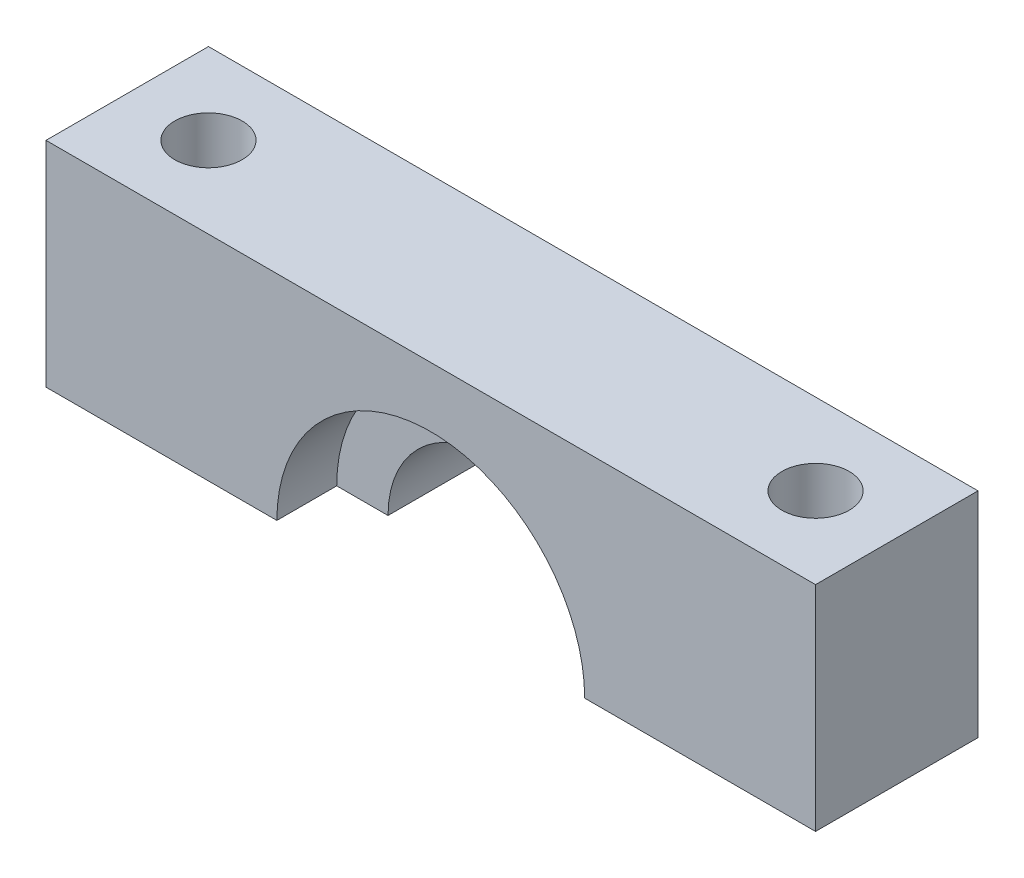
ISO-10303-21;
HEADER;
FILE_DESCRIPTION(('STEP AP214'),'2;1');
FILE_NAME('part.step','',(''),(''),'','','');
FILE_SCHEMA(('AUTOMOTIVE_DESIGN { 1 0 10303 214 1 1 1 1 }'));
ENDSEC;
DATA;
#1=APPLICATION_CONTEXT('core data for automotive mechanical design processes');
#2=APPLICATION_PROTOCOL_DEFINITION('international standard','automotive_design',2000,#1);
#3=PRODUCT_CONTEXT('',#1,'mechanical');
#4=PRODUCT('Part','Part','',(#3));
#5=PRODUCT_RELATED_PRODUCT_CATEGORY('part','',(#4));
#6=PRODUCT_DEFINITION_FORMATION('','',#4);
#7=PRODUCT_DEFINITION_CONTEXT('part definition',#1,'design');
#8=PRODUCT_DEFINITION('design','',#6,#7);
#9=PRODUCT_DEFINITION_SHAPE('','',#8);
#10=(LENGTH_UNIT() NAMED_UNIT(*) SI_UNIT(.MILLI.,.METRE.));
#11=(NAMED_UNIT(*) PLANE_ANGLE_UNIT() SI_UNIT($,.RADIAN.));
#12=(NAMED_UNIT(*) SI_UNIT($,.STERADIAN.) SOLID_ANGLE_UNIT());
#13=UNCERTAINTY_MEASURE_WITH_UNIT(LENGTH_MEASURE(1.E-05),#10,'distance_accuracy_value','');
#14=(GEOMETRIC_REPRESENTATION_CONTEXT(3) GLOBAL_UNCERTAINTY_ASSIGNED_CONTEXT((#13)) GLOBAL_UNIT_ASSIGNED_CONTEXT((#10,
#11,#12)) REPRESENTATION_CONTEXT('',''));
#15=CARTESIAN_POINT('',(0.,0.,0.));
#16=DIRECTION('',(0.,0.,1.));
#17=DIRECTION('',(1.,0.,0.));
#18=AXIS2_PLACEMENT_3D('',#15,#16,#17);
#19=CARTESIAN_POINT('',(-22.86,-6.35,9.652));
#20=DIRECTION('',(0.,1.,0.));
#21=DIRECTION('',(0.,0.,1.));
#22=AXIS2_PLACEMENT_3D('',#19,#20,#21);
#23=PLANE('',#22);
#24=CARTESIAN_POINT('',(-18.034,-6.35,4.82600000000002));
#25=DIRECTION('',(0.,1.,0.));
#26=DIRECTION('',(0.,0.,1.));
#27=AXIS2_PLACEMENT_3D('',#24,#25,#26);
#28=CIRCLE('',#27,2.);
#29=CARTESIAN_POINT('',(-18.034,-6.35,6.82600000000002));
#30=VERTEX_POINT('',#29);
#31=EDGE_CURVE('E197',#30,#30,#28,.T.);
#32=ORIENTED_EDGE('',*,*,#31,.T.);
#33=EDGE_LOOP('',(#32));
#34=FACE_BOUND('',#33,.T.);
#35=DIRECTION('',(1.,0.,0.));
#36=VECTOR('',#35,1.);
#37=CARTESIAN_POINT('',(-22.86,-6.35,0.));
#38=LINE('',#37,#36);
#39=CARTESIAN_POINT('',(-22.86,-6.35,0.));
#40=VERTEX_POINT('',#39);
#41=CARTESIAN_POINT('',(-6.096,-6.35,0.));
#42=VERTEX_POINT('',#41);
#43=EDGE_CURVE('E126',#40,#42,#38,.T.);
#44=ORIENTED_EDGE('',*,*,#43,.T.);
#45=DIRECTION('',(0.,0.,1.));
#46=VECTOR('',#45,1.);
#47=CARTESIAN_POINT('',(-6.096,-6.35,0.));
#48=LINE('',#47,#46);
#49=CARTESIAN_POINT('',(-6.096,-6.35,6.09600000000002));
#50=VERTEX_POINT('',#49);
#51=EDGE_CURVE('E110',#42,#50,#48,.T.);
#52=ORIENTED_EDGE('',*,*,#51,.T.);
#53=DIRECTION('',(1.,0.,0.));
#54=VECTOR('',#53,1.);
#55=CARTESIAN_POINT('',(-9.144,-6.35,6.09600000000002));
#56=LINE('',#55,#54);
#57=CARTESIAN_POINT('',(-9.144,-6.35,6.09600000000002));
#58=VERTEX_POINT('',#57);
#59=EDGE_CURVE('E181',#58,#50,#56,.T.);
#60=ORIENTED_EDGE('',*,*,#59,.F.);
#61=DIRECTION('',(0.,0.,1.));
#62=VECTOR('',#61,1.);
#63=CARTESIAN_POINT('',(-9.144,-6.35,6.09600000000002));
#64=LINE('',#63,#62);
#65=CARTESIAN_POINT('',(-9.144,-6.35,9.65200000000002));
#66=VERTEX_POINT('',#65);
#67=EDGE_CURVE('E177',#58,#66,#64,.T.);
#68=ORIENTED_EDGE('',*,*,#67,.T.);
#69=DIRECTION('',(1.,0.,0.));
#70=VECTOR('',#69,1.);
#71=CARTESIAN_POINT('',(-22.86,-6.35,9.652));
#72=LINE('',#71,#70);
#73=CARTESIAN_POINT('',(-22.86,-6.35,9.652));
#74=VERTEX_POINT('',#73);
#75=EDGE_CURVE('E151',#74,#66,#72,.T.);
#76=ORIENTED_EDGE('',*,*,#75,.F.);
#77=DIRECTION('',(0.,0.,-1.));
#78=VECTOR('',#77,1.);
#79=CARTESIAN_POINT('',(-22.86,-6.35,9.652));
#80=LINE('',#79,#78);
#81=EDGE_CURVE('E134',#74,#40,#80,.T.);
#82=ORIENTED_EDGE('',*,*,#81,.T.);
#83=EDGE_LOOP('',(#44,#52,#60,#68,#76,#82));
#84=FACE_BOUND('',#83,.T.);
#85=ADVANCED_FACE('F45',(#34,#84),#23,.F.);
#86=CARTESIAN_POINT('',(22.86,-6.35,9.652));
#87=DIRECTION('',(-1.,0.,0.));
#88=DIRECTION('',(0.,0.,1.));
#89=AXIS2_PLACEMENT_3D('',#86,#87,#88);
#90=PLANE('',#89);
#91=DIRECTION('',(0.,1.,0.));
#92=VECTOR('',#91,1.);
#93=CARTESIAN_POINT('',(22.86,-6.35,0.));
#94=LINE('',#93,#92);
#95=CARTESIAN_POINT('',(22.86,-6.35,0.));
#96=VERTEX_POINT('',#95);
#97=CARTESIAN_POINT('',(22.86,6.35,0.));
#98=VERTEX_POINT('',#97);
#99=EDGE_CURVE('E164',#96,#98,#94,.T.);
#100=ORIENTED_EDGE('',*,*,#99,.T.);
#101=DIRECTION('',(0.,0.,-1.));
#102=VECTOR('',#101,1.);
#103=CARTESIAN_POINT('',(22.86,6.35,9.652));
#104=LINE('',#103,#102);
#105=CARTESIAN_POINT('',(22.86,6.35,9.652));
#106=VERTEX_POINT('',#105);
#107=EDGE_CURVE('E11',#106,#98,#104,.T.);
#108=ORIENTED_EDGE('',*,*,#107,.F.);
#109=DIRECTION('',(0.,1.,0.));
#110=VECTOR('',#109,1.);
#111=CARTESIAN_POINT('',(22.86,-6.35,9.652));
#112=LINE('',#111,#110);
#113=CARTESIAN_POINT('',(22.86,-6.35,9.652));
#114=VERTEX_POINT('',#113);
#115=EDGE_CURVE('E136',#114,#106,#112,.T.);
#116=ORIENTED_EDGE('',*,*,#115,.F.);
#117=DIRECTION('',(0.,0.,-1.));
#118=VECTOR('',#117,1.);
#119=CARTESIAN_POINT('',(22.86,-6.35,9.652));
#120=LINE('',#119,#118);
#121=EDGE_CURVE('E147',#114,#96,#120,.T.);
#122=ORIENTED_EDGE('',*,*,#121,.T.);
#123=EDGE_LOOP('',(#100,#108,#116,#122));
#124=FACE_BOUND('',#123,.T.);
#125=ADVANCED_FACE('F47',(#124),#90,.F.);
#126=CARTESIAN_POINT('',(-22.86,6.35,9.652));
#127=DIRECTION('',(0.,-1.,0.));
#128=DIRECTION('',(0.,0.,-1.));
#129=AXIS2_PLACEMENT_3D('',#126,#127,#128);
#130=PLANE('',#129);
#131=CARTESIAN_POINT('',(-18.034,6.35,4.826));
#132=DIRECTION('',(0.,1.,0.));
#133=DIRECTION('',(0.,0.,1.));
#134=AXIS2_PLACEMENT_3D('',#131,#132,#133);
#135=CIRCLE('',#134,2.);
#136=CARTESIAN_POINT('',(-18.034,6.35,6.82600000000001));
#137=VERTEX_POINT('',#136);
#138=EDGE_CURVE('E207',#137,#137,#135,.T.);
#139=ORIENTED_EDGE('',*,*,#138,.F.);
#140=EDGE_LOOP('',(#139));
#141=FACE_BOUND('',#140,.T.);
#142=CARTESIAN_POINT('',(18.034,6.35,4.826));
#143=DIRECTION('',(0.,1.,0.));
#144=DIRECTION('',(0.,0.,-1.));
#145=AXIS2_PLACEMENT_3D('',#142,#143,#144);
#146=CIRCLE('',#145,2.);
#147=CARTESIAN_POINT('',(18.034,6.35,2.82599999999999));
#148=VERTEX_POINT('',#147);
#149=EDGE_CURVE('E203',#148,#148,#146,.T.);
#150=ORIENTED_EDGE('',*,*,#149,.F.);
#151=EDGE_LOOP('',(#150));
#152=FACE_BOUND('',#151,.T.);
#153=DIRECTION('',(-1.,0.,0.));
#154=VECTOR('',#153,1.);
#155=CARTESIAN_POINT('',(-22.86,6.35,0.));
#156=LINE('',#155,#154);
#157=CARTESIAN_POINT('',(-22.86,6.35,0.));
#158=VERTEX_POINT('',#157);
#159=EDGE_CURVE('E161',#98,#158,#156,.T.);
#160=ORIENTED_EDGE('',*,*,#159,.T.);
#161=DIRECTION('',(0.,0.,-1.));
#162=VECTOR('',#161,1.);
#163=CARTESIAN_POINT('',(-22.86,6.35,9.652));
#164=LINE('',#163,#162);
#165=CARTESIAN_POINT('',(-22.86,6.35,9.652));
#166=VERTEX_POINT('',#165);
#167=EDGE_CURVE('E54',#166,#158,#164,.T.);
#168=ORIENTED_EDGE('',*,*,#167,.F.);
#169=DIRECTION('',(-1.,0.,0.));
#170=VECTOR('',#169,1.);
#171=CARTESIAN_POINT('',(-22.86,6.35,9.652));
#172=LINE('',#171,#170);
#173=EDGE_CURVE('E141',#106,#166,#172,.T.);
#174=ORIENTED_EDGE('',*,*,#173,.F.);
#175=ORIENTED_EDGE('',*,*,#107,.T.);
#176=EDGE_LOOP('',(#160,#168,#174,#175));
#177=FACE_BOUND('',#176,.T.);
#178=ADVANCED_FACE('F223',(#141,#152,#177),#130,.F.);
#179=CARTESIAN_POINT('',(-22.86,-6.35,9.652));
#180=DIRECTION('',(1.,0.,0.));
#181=DIRECTION('',(0.,0.,-1.));
#182=AXIS2_PLACEMENT_3D('',#179,#180,#181);
#183=PLANE('',#182);
#184=DIRECTION('',(0.,-1.,0.));
#185=VECTOR('',#184,1.);
#186=CARTESIAN_POINT('',(-22.86,-6.35,0.));
#187=LINE('',#186,#185);
#188=EDGE_CURVE('E143',#158,#40,#187,.T.);
#189=ORIENTED_EDGE('',*,*,#188,.T.);
#190=ORIENTED_EDGE('',*,*,#81,.F.);
#191=DIRECTION('',(0.,-1.,0.));
#192=VECTOR('',#191,1.);
#193=CARTESIAN_POINT('',(-22.86,-6.35,9.652));
#194=LINE('',#193,#192);
#195=EDGE_CURVE('E159',#166,#74,#194,.T.);
#196=ORIENTED_EDGE('',*,*,#195,.F.);
#197=ORIENTED_EDGE('',*,*,#167,.T.);
#198=EDGE_LOOP('',(#189,#190,#196,#197));
#199=FACE_BOUND('',#198,.T.);
#200=ADVANCED_FACE('F158',(#199),#183,.F.);
#201=CARTESIAN_POINT('',(18.034,-6.35,4.826));
#202=DIRECTION('',(0.,1.,0.));
#203=DIRECTION('',(0.,0.,-1.));
#204=AXIS2_PLACEMENT_3D('',#201,#202,#203);
#205=CIRCLE('',#204,2.);
#206=CARTESIAN_POINT('',(18.034,-6.35,2.826));
#207=VERTEX_POINT('',#206);
#208=EDGE_CURVE('E199',#207,#207,#205,.T.);
#209=ORIENTED_EDGE('',*,*,#208,.T.);
#210=EDGE_LOOP('',(#209));
#211=FACE_BOUND('',#210,.T.);
#212=CARTESIAN_POINT('',(6.096,-6.35,6.096));
#213=VERTEX_POINT('',#212);
#214=CARTESIAN_POINT('',(9.144,-6.35,6.096));
#215=VERTEX_POINT('',#214);
#216=EDGE_CURVE('E190',#213,#215,#56,.T.);
#217=ORIENTED_EDGE('',*,*,#216,.F.);
#218=DIRECTION('',(0.,0.,1.));
#219=VECTOR('',#218,1.);
#220=CARTESIAN_POINT('',(6.096,-6.35,0.));
#221=LINE('',#220,#219);
#222=CARTESIAN_POINT('',(6.096,-6.35,0.));
#223=VERTEX_POINT('',#222);
#224=EDGE_CURVE('E61',#223,#213,#221,.T.);
#225=ORIENTED_EDGE('',*,*,#224,.F.);
#226=EDGE_CURVE('E128',#223,#96,#38,.T.);
#227=ORIENTED_EDGE('',*,*,#226,.T.);
#228=ORIENTED_EDGE('',*,*,#121,.F.);
#229=CARTESIAN_POINT('',(9.144,-6.35,9.652));
#230=VERTEX_POINT('',#229);
#231=EDGE_CURVE('E172',#230,#114,#72,.T.);
#232=ORIENTED_EDGE('',*,*,#231,.F.);
#233=DIRECTION('',(0.,0.,1.));
#234=VECTOR('',#233,1.);
#235=CARTESIAN_POINT('',(9.144,-6.35,6.096));
#236=LINE('',#235,#234);
#237=EDGE_CURVE('E69',#215,#230,#236,.T.);
#238=ORIENTED_EDGE('',*,*,#237,.F.);
#239=EDGE_LOOP('',(#217,#225,#227,#228,#232,#238));
#240=FACE_BOUND('',#239,.T.);
#241=ADVANCED_FACE('F240',(#211,#240),#23,.F.);
#242=CARTESIAN_POINT('',(0.,0.,9.652));
#243=DIRECTION('',(0.,0.,-1.));
#244=DIRECTION('',(-1.,0.,0.));
#245=AXIS2_PLACEMENT_3D('',#242,#243,#244);
#246=PLANE('',#245);
#247=ORIENTED_EDGE('',*,*,#75,.T.);
#248=CARTESIAN_POINT('',(0.,-6.35,9.652));
#249=DIRECTION('',(0.,0.,1.));
#250=DIRECTION('',(-1.,0.,0.));
#251=AXIS2_PLACEMENT_3D('',#248,#249,#250);
#252=CIRCLE('',#251,9.144);
#253=EDGE_CURVE('E184',#230,#66,#252,.T.);
#254=ORIENTED_EDGE('',*,*,#253,.F.);
#255=ORIENTED_EDGE('',*,*,#231,.T.);
#256=ORIENTED_EDGE('',*,*,#115,.T.);
#257=ORIENTED_EDGE('',*,*,#173,.T.);
#258=ORIENTED_EDGE('',*,*,#195,.T.);
#259=EDGE_LOOP('',(#247,#254,#255,#256,#257,#258));
#260=FACE_BOUND('',#259,.T.);
#261=ADVANCED_FACE('F250',(#260),#246,.F.);
#262=CARTESIAN_POINT('',(0.,0.,0.));
#263=DIRECTION('',(0.,0.,-1.));
#264=DIRECTION('',(-1.,0.,0.));
#265=AXIS2_PLACEMENT_3D('',#262,#263,#264);
#266=PLANE('',#265);
#267=CARTESIAN_POINT('',(0.,-6.35000000000001,0.));
#268=DIRECTION('',(0.,0.,1.));
#269=DIRECTION('',(-1.,0.,0.));
#270=AXIS2_PLACEMENT_3D('',#267,#268,#269);
#271=CIRCLE('',#270,6.096);
#272=EDGE_CURVE('E113',#223,#42,#271,.T.);
#273=ORIENTED_EDGE('',*,*,#272,.T.);
#274=ORIENTED_EDGE('',*,*,#43,.F.);
#275=ORIENTED_EDGE('',*,*,#188,.F.);
#276=ORIENTED_EDGE('',*,*,#159,.F.);
#277=ORIENTED_EDGE('',*,*,#99,.F.);
#278=ORIENTED_EDGE('',*,*,#226,.F.);
#279=EDGE_LOOP('',(#273,#274,#275,#276,#277,#278));
#280=FACE_BOUND('',#279,.T.);
#281=ADVANCED_FACE('F124',(#280),#266,.T.);
#282=CARTESIAN_POINT('',(0.,-6.35,6.096));
#283=DIRECTION('',(0.,0.,1.));
#284=DIRECTION('',(1.,0.,0.));
#285=AXIS2_PLACEMENT_3D('',#282,#283,#284);
#286=CYLINDRICAL_SURFACE('',#285,9.144);
#287=ORIENTED_EDGE('',*,*,#253,.T.);
#288=ORIENTED_EDGE('',*,*,#67,.F.);
#289=CARTESIAN_POINT('',(0.,-6.35,6.096));
#290=DIRECTION('',(0.,0.,1.));
#291=DIRECTION('',(-1.,0.,0.));
#292=AXIS2_PLACEMENT_3D('',#289,#290,#291);
#293=CIRCLE('',#292,9.144);
#294=EDGE_CURVE('E187',#215,#58,#293,.T.);
#295=ORIENTED_EDGE('',*,*,#294,.F.);
#296=ORIENTED_EDGE('',*,*,#237,.T.);
#297=EDGE_LOOP('',(#287,#288,#295,#296));
#298=FACE_BOUND('',#297,.T.);
#299=ADVANCED_FACE('F264',(#298),#286,.F.);
#300=CARTESIAN_POINT('',(0.,-6.35,6.096));
#301=DIRECTION('',(0.,0.,-1.));
#302=DIRECTION('',(-1.,0.,0.));
#303=AXIS2_PLACEMENT_3D('',#300,#301,#302);
#304=PLANE('',#303);
#305=ORIENTED_EDGE('',*,*,#59,.T.);
#306=CARTESIAN_POINT('',(0.,-6.35000000000001,6.096));
#307=DIRECTION('',(0.,0.,1.));
#308=DIRECTION('',(-1.,0.,0.));
#309=AXIS2_PLACEMENT_3D('',#306,#307,#308);
#310=CIRCLE('',#309,6.096);
#311=EDGE_CURVE('E114',#213,#50,#310,.T.);
#312=ORIENTED_EDGE('',*,*,#311,.F.);
#313=ORIENTED_EDGE('',*,*,#216,.T.);
#314=ORIENTED_EDGE('',*,*,#294,.T.);
#315=EDGE_LOOP('',(#305,#312,#313,#314));
#316=FACE_BOUND('',#315,.T.);
#317=ADVANCED_FACE('F235',(#316),#304,.F.);
#318=CARTESIAN_POINT('',(0.,-6.35000000000001,0.));
#319=DIRECTION('',(0.,0.,1.));
#320=DIRECTION('',(1.,0.,0.));
#321=AXIS2_PLACEMENT_3D('',#318,#319,#320);
#322=CYLINDRICAL_SURFACE('',#321,6.096);
#323=ORIENTED_EDGE('',*,*,#311,.T.);
#324=ORIENTED_EDGE('',*,*,#51,.F.);
#325=ORIENTED_EDGE('',*,*,#272,.F.);
#326=ORIENTED_EDGE('',*,*,#224,.T.);
#327=EDGE_LOOP('',(#323,#324,#325,#326));
#328=FACE_BOUND('',#327,.T.);
#329=ADVANCED_FACE('F112',(#328),#322,.F.);
#330=CARTESIAN_POINT('',(18.034,-6.35,4.826));
#331=DIRECTION('',(0.,1.,0.));
#332=DIRECTION('',(0.,0.,1.));
#333=AXIS2_PLACEMENT_3D('',#330,#331,#332);
#334=CYLINDRICAL_SURFACE('',#333,2.);
#335=ORIENTED_EDGE('',*,*,#208,.F.);
#336=EDGE_LOOP('',(#335));
#337=FACE_BOUND('',#336,.T.);
#338=ORIENTED_EDGE('',*,*,#149,.T.);
#339=EDGE_LOOP('',(#338));
#340=FACE_BOUND('',#339,.T.);
#341=ADVANCED_FACE('F219',(#337,#340),#334,.F.);
#342=CARTESIAN_POINT('',(-18.034,-6.35,4.82600000000002));
#343=DIRECTION('',(0.,1.,0.));
#344=DIRECTION('',(0.,0.,1.));
#345=AXIS2_PLACEMENT_3D('',#342,#343,#344);
#346=CYLINDRICAL_SURFACE('',#345,2.);
#347=ORIENTED_EDGE('',*,*,#31,.F.);
#348=EDGE_LOOP('',(#347));
#349=FACE_BOUND('',#348,.T.);
#350=ORIENTED_EDGE('',*,*,#138,.T.);
#351=EDGE_LOOP('',(#350));
#352=FACE_BOUND('',#351,.T.);
#353=ADVANCED_FACE('F216',(#349,#352),#346,.F.);
#354=CLOSED_SHELL('',(#85,#125,#178,#200,#241,#261,#281,#299,#317,#329,#341,#353));
#355=MANIFOLD_SOLID_BREP('B2',#354);
#356=ADVANCED_BREP_SHAPE_REPRESENTATION('',(#18,#355),#14);
#357=SHAPE_DEFINITION_REPRESENTATION(#9,#356);
ENDSEC;
END-ISO-10303-21;
